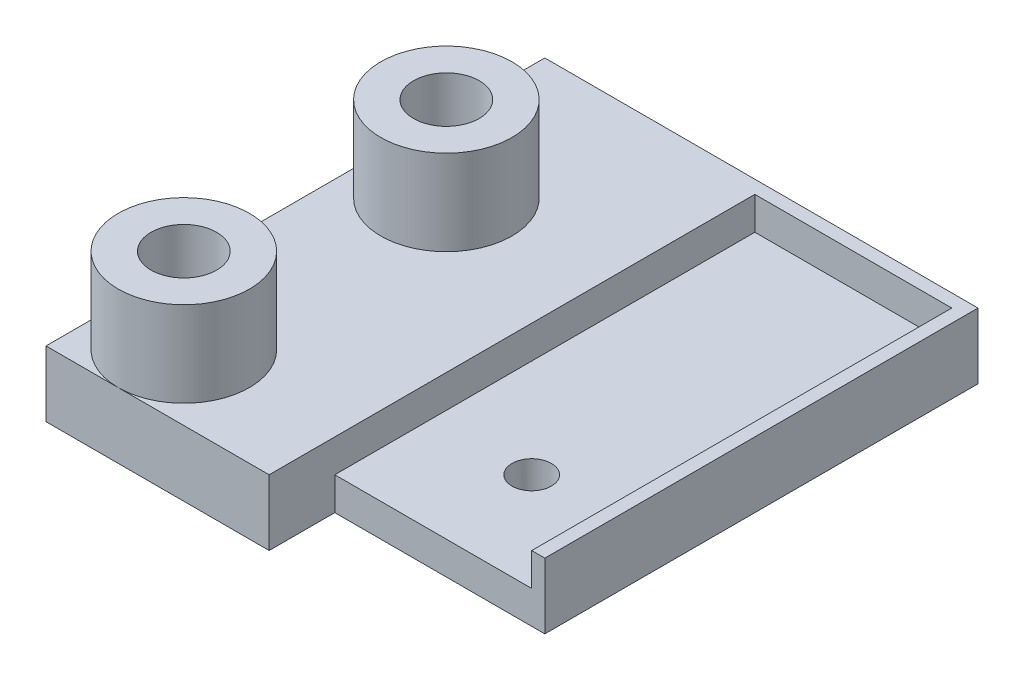
ISO-10303-21;
HEADER;
FILE_DESCRIPTION(('STEP AP214'),'2;1');
FILE_NAME('part.step','',(''),(''),'','','');
FILE_SCHEMA(('AUTOMOTIVE_DESIGN { 1 0 10303 214 1 1 1 1 }'));
ENDSEC;
DATA;
#1=APPLICATION_CONTEXT('core data for automotive mechanical design processes');
#2=APPLICATION_PROTOCOL_DEFINITION('international standard','automotive_design',2000,#1);
#3=PRODUCT_CONTEXT('',#1,'mechanical');
#4=PRODUCT('Part','Part','',(#3));
#5=PRODUCT_RELATED_PRODUCT_CATEGORY('part','',(#4));
#6=PRODUCT_DEFINITION_FORMATION('','',#4);
#7=PRODUCT_DEFINITION_CONTEXT('part definition',#1,'design');
#8=PRODUCT_DEFINITION('design','',#6,#7);
#9=PRODUCT_DEFINITION_SHAPE('','',#8);
#10=(LENGTH_UNIT() NAMED_UNIT(*) SI_UNIT(.MILLI.,.METRE.));
#11=(NAMED_UNIT(*) PLANE_ANGLE_UNIT() SI_UNIT($,.RADIAN.));
#12=(NAMED_UNIT(*) SI_UNIT($,.STERADIAN.) SOLID_ANGLE_UNIT());
#13=UNCERTAINTY_MEASURE_WITH_UNIT(LENGTH_MEASURE(1.E-05),#10,'distance_accuracy_value','');
#14=(GEOMETRIC_REPRESENTATION_CONTEXT(3) GLOBAL_UNCERTAINTY_ASSIGNED_CONTEXT((#13)) GLOBAL_UNIT_ASSIGNED_CONTEXT((#10,
#11,#12)) REPRESENTATION_CONTEXT('',''));
#15=CARTESIAN_POINT('',(0.,0.,0.));
#16=DIRECTION('',(0.,0.,1.));
#17=DIRECTION('',(1.,0.,0.));
#18=AXIS2_PLACEMENT_3D('',#15,#16,#17);
#19=CARTESIAN_POINT('',(0.,5.,0.));
#20=DIRECTION('',(0.,0.,-1.));
#21=DIRECTION('',(-1.,0.,0.));
#22=AXIS2_PLACEMENT_3D('',#19,#20,#21);
#23=PLANE('',#22);
#24=DIRECTION('',(0.,1.,0.));
#25=VECTOR('',#24,1.);
#26=CARTESIAN_POINT('',(-16.,-17.7200451466694,0.));
#27=LINE('',#26,#25);
#28=CARTESIAN_POINT('',(-16.,0.,0.));
#29=VERTEX_POINT('',#28);
#30=CARTESIAN_POINT('',(-16.,2.5,0.));
#31=VERTEX_POINT('',#30);
#32=EDGE_CURVE('E65',#29,#31,#27,.T.);
#33=ORIENTED_EDGE('',*,*,#32,.F.);
#34=DIRECTION('',(1.,0.,0.));
#35=VECTOR('',#34,1.);
#36=CARTESIAN_POINT('',(0.,0.,0.));
#37=LINE('',#36,#35);
#38=CARTESIAN_POINT('',(0.,0.,0.));
#39=VERTEX_POINT('',#38);
#40=EDGE_CURVE('E200',#29,#39,#37,.T.);
#41=ORIENTED_EDGE('',*,*,#40,.T.);
#42=DIRECTION('',(0.,-1.,0.));
#43=VECTOR('',#42,1.);
#44=CARTESIAN_POINT('',(0.,5.,0.));
#45=LINE('',#44,#43);
#46=CARTESIAN_POINT('',(0.,5.,0.));
#47=VERTEX_POINT('',#46);
#48=EDGE_CURVE('E205',#47,#39,#45,.T.);
#49=ORIENTED_EDGE('',*,*,#48,.F.);
#50=DIRECTION('',(1.,0.,0.));
#51=VECTOR('',#50,1.);
#52=CARTESIAN_POINT('',(0.,5.,0.));
#53=LINE('',#52,#51);
#54=CARTESIAN_POINT('',(-0.999999999999996,5.,0.));
#55=VERTEX_POINT('',#54);
#56=EDGE_CURVE('E130',#55,#47,#53,.T.);
#57=ORIENTED_EDGE('',*,*,#56,.F.);
#58=DIRECTION('',(0.,1.,0.));
#59=VECTOR('',#58,1.);
#60=CARTESIAN_POINT('',(-0.999999999999996,2.5,0.));
#61=LINE('',#60,#59);
#62=CARTESIAN_POINT('',(-0.999999999999996,2.5,0.));
#63=VERTEX_POINT('',#62);
#64=EDGE_CURVE('E187',#63,#55,#61,.T.);
#65=ORIENTED_EDGE('',*,*,#64,.F.);
#66=DIRECTION('',(1.,0.,0.));
#67=VECTOR('',#66,1.);
#68=CARTESIAN_POINT('',(-0.999999999999996,2.5,0.));
#69=LINE('',#68,#67);
#70=EDGE_CURVE('E172',#31,#63,#69,.T.);
#71=ORIENTED_EDGE('',*,*,#70,.F.);
#72=EDGE_LOOP('',(#33,#41,#49,#57,#65,#71));
#73=FACE_BOUND('',#72,.T.);
#74=ADVANCED_FACE('F43',(#73),#23,.F.);
#75=CARTESIAN_POINT('',(0.,5.,0.));
#76=DIRECTION('',(-1.,0.,0.));
#77=DIRECTION('',(0.,0.,1.));
#78=AXIS2_PLACEMENT_3D('',#75,#76,#77);
#79=PLANE('',#78);
#80=DIRECTION('',(0.,0.,-1.));
#81=VECTOR('',#80,1.);
#82=CARTESIAN_POINT('',(0.,0.,0.));
#83=LINE('',#82,#81);
#84=CARTESIAN_POINT('',(0.,0.,-33.));
#85=VERTEX_POINT('',#84);
#86=EDGE_CURVE('E190',#39,#85,#83,.T.);
#87=ORIENTED_EDGE('',*,*,#86,.T.);
#88=DIRECTION('',(0.,-1.,0.));
#89=VECTOR('',#88,1.);
#90=CARTESIAN_POINT('',(0.,5.,-33.));
#91=LINE('',#90,#89);
#92=CARTESIAN_POINT('',(0.,5.,-33.));
#93=VERTEX_POINT('',#92);
#94=EDGE_CURVE('E11',#93,#85,#91,.T.);
#95=ORIENTED_EDGE('',*,*,#94,.F.);
#96=DIRECTION('',(0.,0.,-1.));
#97=VECTOR('',#96,1.);
#98=CARTESIAN_POINT('',(0.,5.,0.));
#99=LINE('',#98,#97);
#100=EDGE_CURVE('E197',#47,#93,#99,.T.);
#101=ORIENTED_EDGE('',*,*,#100,.F.);
#102=ORIENTED_EDGE('',*,*,#48,.T.);
#103=EDGE_LOOP('',(#87,#95,#101,#102));
#104=FACE_BOUND('',#103,.T.);
#105=ADVANCED_FACE('F45',(#104),#79,.F.);
#106=CARTESIAN_POINT('',(0.,5.,-33.));
#107=DIRECTION('',(0.,0.,1.));
#108=DIRECTION('',(1.,0.,0.));
#109=AXIS2_PLACEMENT_3D('',#106,#107,#108);
#110=PLANE('',#109);
#111=DIRECTION('',(-1.,0.,0.));
#112=VECTOR('',#111,1.);
#113=CARTESIAN_POINT('',(0.,0.,-33.));
#114=LINE('',#113,#112);
#115=CARTESIAN_POINT('',(-33.,0.,-33.));
#116=VERTEX_POINT('',#115);
#117=EDGE_CURVE('E209',#85,#116,#114,.T.);
#118=ORIENTED_EDGE('',*,*,#117,.T.);
#119=DIRECTION('',(0.,-1.,0.));
#120=VECTOR('',#119,1.);
#121=CARTESIAN_POINT('',(-33.,5.,-33.));
#122=LINE('',#121,#120);
#123=CARTESIAN_POINT('',(-33.,5.,-33.));
#124=VERTEX_POINT('',#123);
#125=EDGE_CURVE('E53',#124,#116,#122,.T.);
#126=ORIENTED_EDGE('',*,*,#125,.F.);
#127=DIRECTION('',(-1.,0.,0.));
#128=VECTOR('',#127,1.);
#129=CARTESIAN_POINT('',(0.,5.,-33.));
#130=LINE('',#129,#128);
#131=EDGE_CURVE('E125',#93,#124,#130,.T.);
#132=ORIENTED_EDGE('',*,*,#131,.F.);
#133=ORIENTED_EDGE('',*,*,#94,.T.);
#134=EDGE_LOOP('',(#118,#126,#132,#133));
#135=FACE_BOUND('',#134,.T.);
#136=ADVANCED_FACE('F287',(#135),#110,.F.);
#137=CARTESIAN_POINT('',(-33.,5.,0.));
#138=DIRECTION('',(1.,0.,0.));
#139=DIRECTION('',(0.,0.,-1.));
#140=AXIS2_PLACEMENT_3D('',#137,#138,#139);
#141=PLANE('',#140);
#142=DIRECTION('',(0.,0.,1.));
#143=VECTOR('',#142,1.);
#144=CARTESIAN_POINT('',(-33.,0.,0.));
#145=LINE('',#144,#143);
#146=CARTESIAN_POINT('',(-33.,0.,5.));
#147=VERTEX_POINT('',#146);
#148=EDGE_CURVE('E136',#116,#147,#145,.T.);
#149=ORIENTED_EDGE('',*,*,#148,.T.);
#150=DIRECTION('',(0.,1.,0.));
#151=VECTOR('',#150,1.);
#152=CARTESIAN_POINT('',(-33.,-17.7200451466694,5.));
#153=LINE('',#152,#151);
#154=CARTESIAN_POINT('',(-33.,5.,5.));
#155=VERTEX_POINT('',#154);
#156=EDGE_CURVE('E133',#147,#155,#153,.T.);
#157=ORIENTED_EDGE('',*,*,#156,.T.);
#158=DIRECTION('',(0.,0.,1.));
#159=VECTOR('',#158,1.);
#160=CARTESIAN_POINT('',(-33.,5.,0.));
#161=LINE('',#160,#159);
#162=EDGE_CURVE('E119',#124,#155,#161,.T.);
#163=ORIENTED_EDGE('',*,*,#162,.F.);
#164=ORIENTED_EDGE('',*,*,#125,.T.);
#165=EDGE_LOOP('',(#149,#157,#163,#164));
#166=FACE_BOUND('',#165,.T.);
#167=ADVANCED_FACE('F134',(#166),#141,.F.);
#168=CARTESIAN_POINT('',(0.,5.,0.));
#169=DIRECTION('',(0.,1.,0.));
#170=DIRECTION('',(0.,0.,1.));
#171=AXIS2_PLACEMENT_3D('',#168,#169,#170);
#172=PLANE('',#171);
#173=CARTESIAN_POINT('',(-27.5,5.,-20.));
#174=DIRECTION('',(0.,1.,0.));
#175=DIRECTION('',(0.,0.,1.));
#176=AXIS2_PLACEMENT_3D('',#173,#174,#175);
#177=CIRCLE('',#176,5.);
#178=CARTESIAN_POINT('',(-27.5,5.,-25.));
#179=VERTEX_POINT('',#178);
#180=EDGE_CURVE('E229',#179,#179,#177,.T.);
#181=ORIENTED_EDGE('',*,*,#180,.F.);
#182=EDGE_LOOP('',(#181));
#183=FACE_BOUND('',#182,.T.);
#184=DIRECTION('',(1.,0.,0.));
#185=VECTOR('',#184,1.);
#186=CARTESIAN_POINT('',(-16.,5.,5.));
#187=LINE('',#186,#185);
#188=CARTESIAN_POINT('',(-27.5,5.,5.));
#189=VERTEX_POINT('',#188);
#190=EDGE_CURVE('E123',#155,#189,#187,.T.);
#191=ORIENTED_EDGE('',*,*,#190,.T.);
#192=CARTESIAN_POINT('',(-27.5,5.,0.));
#193=DIRECTION('',(0.,1.,0.));
#194=DIRECTION('',(0.,0.,1.));
#195=AXIS2_PLACEMENT_3D('',#192,#193,#194);
#196=CIRCLE('',#195,5.);
#197=EDGE_CURVE('E58',#189,#189,#196,.T.);
#198=ORIENTED_EDGE('',*,*,#197,.F.);
#199=CARTESIAN_POINT('',(-16.,5.,5.));
#200=VERTEX_POINT('',#199);
#201=EDGE_CURVE('E146',#189,#200,#187,.T.);
#202=ORIENTED_EDGE('',*,*,#201,.T.);
#203=DIRECTION('',(0.,0.,1.));
#204=VECTOR('',#203,1.);
#205=CARTESIAN_POINT('',(-16.,5.,-32.));
#206=LINE('',#205,#204);
#207=CARTESIAN_POINT('',(-16.,5.,-32.));
#208=VERTEX_POINT('',#207);
#209=EDGE_CURVE('E165',#208,#200,#206,.T.);
#210=ORIENTED_EDGE('',*,*,#209,.F.);
#211=DIRECTION('',(-1.,0.,0.));
#212=VECTOR('',#211,1.);
#213=CARTESIAN_POINT('',(-1.,5.,-32.));
#214=LINE('',#213,#212);
#215=CARTESIAN_POINT('',(-1.,5.,-32.));
#216=VERTEX_POINT('',#215);
#217=EDGE_CURVE('E180',#216,#208,#214,.T.);
#218=ORIENTED_EDGE('',*,*,#217,.F.);
#219=DIRECTION('',(0.,0.,-1.));
#220=VECTOR('',#219,1.);
#221=CARTESIAN_POINT('',(-1.,5.,-32.));
#222=LINE('',#221,#220);
#223=EDGE_CURVE('E177',#55,#216,#222,.T.);
#224=ORIENTED_EDGE('',*,*,#223,.F.);
#225=ORIENTED_EDGE('',*,*,#56,.T.);
#226=ORIENTED_EDGE('',*,*,#100,.T.);
#227=ORIENTED_EDGE('',*,*,#131,.T.);
#228=ORIENTED_EDGE('',*,*,#162,.T.);
#229=EDGE_LOOP('',(#191,#198,#202,#210,#218,#224,#225,#226,#227,#228));
#230=FACE_BOUND('',#229,.T.);
#231=ADVANCED_FACE('F121',(#183,#230),#172,.T.);
#232=CARTESIAN_POINT('',(0.,0.,0.));
#233=DIRECTION('',(0.,1.,0.));
#234=DIRECTION('',(0.,0.,1.));
#235=AXIS2_PLACEMENT_3D('',#232,#233,#234);
#236=PLANE('',#235);
#237=CARTESIAN_POINT('',(-27.5,0.,-20.));
#238=DIRECTION('',(0.,1.,0.));
#239=DIRECTION('',(0.,0.,1.));
#240=AXIS2_PLACEMENT_3D('',#237,#238,#239);
#241=CIRCLE('',#240,2.5);
#242=CARTESIAN_POINT('',(-27.5,0.,-22.5));
#243=VERTEX_POINT('',#242);
#244=EDGE_CURVE('E258',#243,#243,#241,.T.);
#245=ORIENTED_EDGE('',*,*,#244,.T.);
#246=EDGE_LOOP('',(#245));
#247=FACE_BOUND('',#246,.T.);
#248=CARTESIAN_POINT('',(-27.5,0.,0.));
#249=DIRECTION('',(0.,1.,0.));
#250=DIRECTION('',(0.,0.,1.));
#251=AXIS2_PLACEMENT_3D('',#248,#249,#250);
#252=CIRCLE('',#251,2.5);
#253=CARTESIAN_POINT('',(-27.5,0.,-2.5));
#254=VERTEX_POINT('',#253);
#255=EDGE_CURVE('E254',#254,#254,#252,.T.);
#256=ORIENTED_EDGE('',*,*,#255,.T.);
#257=EDGE_LOOP('',(#256));
#258=FACE_BOUND('',#257,.T.);
#259=CARTESIAN_POINT('',(-8.5,0.,-7.50000000000001));
#260=DIRECTION('',(0.,1.,0.));
#261=DIRECTION('',(0.,0.,1.));
#262=AXIS2_PLACEMENT_3D('',#259,#260,#261);
#263=CIRCLE('',#262,1.5);
#264=CARTESIAN_POINT('',(-8.5,0.,-6.00000000000001));
#265=VERTEX_POINT('',#264);
#266=EDGE_CURVE('E250',#265,#265,#263,.T.);
#267=ORIENTED_EDGE('',*,*,#266,.T.);
#268=EDGE_LOOP('',(#267));
#269=FACE_BOUND('',#268,.T.);
#270=ORIENTED_EDGE('',*,*,#86,.F.);
#271=ORIENTED_EDGE('',*,*,#40,.F.);
#272=DIRECTION('',(0.,0.,1.));
#273=VECTOR('',#272,1.);
#274=CARTESIAN_POINT('',(-16.,0.,0.));
#275=LINE('',#274,#273);
#276=CARTESIAN_POINT('',(-16.,0.,5.));
#277=VERTEX_POINT('',#276);
#278=EDGE_CURVE('E155',#29,#277,#275,.T.);
#279=ORIENTED_EDGE('',*,*,#278,.T.);
#280=DIRECTION('',(-1.,0.,0.));
#281=VECTOR('',#280,1.);
#282=CARTESIAN_POINT('',(-16.,0.,5.));
#283=LINE('',#282,#281);
#284=EDGE_CURVE('E158',#277,#147,#283,.T.);
#285=ORIENTED_EDGE('',*,*,#284,.T.);
#286=ORIENTED_EDGE('',*,*,#148,.F.);
#287=ORIENTED_EDGE('',*,*,#117,.F.);
#288=EDGE_LOOP('',(#270,#271,#279,#285,#286,#287));
#289=FACE_BOUND('',#288,.T.);
#290=ADVANCED_FACE('F223',(#247,#258,#269,#289),#236,.F.);
#291=CARTESIAN_POINT('',(-1.,2.5,-32.));
#292=DIRECTION('',(1.,0.,0.));
#293=DIRECTION('',(0.,0.,-1.));
#294=AXIS2_PLACEMENT_3D('',#291,#292,#293);
#295=PLANE('',#294);
#296=ORIENTED_EDGE('',*,*,#223,.T.);
#297=DIRECTION('',(0.,1.,0.));
#298=VECTOR('',#297,1.);
#299=CARTESIAN_POINT('',(-1.,2.5,-32.));
#300=LINE('',#299,#298);
#301=CARTESIAN_POINT('',(-1.,2.5,-32.));
#302=VERTEX_POINT('',#301);
#303=EDGE_CURVE('E176',#302,#216,#300,.T.);
#304=ORIENTED_EDGE('',*,*,#303,.F.);
#305=DIRECTION('',(0.,0.,-1.));
#306=VECTOR('',#305,1.);
#307=CARTESIAN_POINT('',(-1.,2.5,-32.));
#308=LINE('',#307,#306);
#309=EDGE_CURVE('E160',#63,#302,#308,.T.);
#310=ORIENTED_EDGE('',*,*,#309,.F.);
#311=ORIENTED_EDGE('',*,*,#64,.T.);
#312=EDGE_LOOP('',(#296,#304,#310,#311));
#313=FACE_BOUND('',#312,.T.);
#314=ADVANCED_FACE('F310',(#313),#295,.F.);
#315=CARTESIAN_POINT('',(-16.,2.5,-32.));
#316=DIRECTION('',(-1.,0.,0.));
#317=DIRECTION('',(0.,0.,1.));
#318=AXIS2_PLACEMENT_3D('',#315,#316,#317);
#319=PLANE('',#318);
#320=ORIENTED_EDGE('',*,*,#209,.T.);
#321=DIRECTION('',(0.,1.,0.));
#322=VECTOR('',#321,1.);
#323=CARTESIAN_POINT('',(-16.,-17.7200451466694,5.));
#324=LINE('',#323,#322);
#325=EDGE_CURVE('E141',#277,#200,#324,.T.);
#326=ORIENTED_EDGE('',*,*,#325,.F.);
#327=ORIENTED_EDGE('',*,*,#278,.F.);
#328=ORIENTED_EDGE('',*,*,#32,.T.);
#329=DIRECTION('',(0.,0.,1.));
#330=VECTOR('',#329,1.);
#331=CARTESIAN_POINT('',(-16.,2.5,-32.));
#332=LINE('',#331,#330);
#333=CARTESIAN_POINT('',(-16.,2.5,-32.));
#334=VERTEX_POINT('',#333);
#335=EDGE_CURVE('E169',#334,#31,#332,.T.);
#336=ORIENTED_EDGE('',*,*,#335,.F.);
#337=DIRECTION('',(0.,1.,0.));
#338=VECTOR('',#337,1.);
#339=CARTESIAN_POINT('',(-16.,2.5,-32.));
#340=LINE('',#339,#338);
#341=EDGE_CURVE('E191',#334,#208,#340,.T.);
#342=ORIENTED_EDGE('',*,*,#341,.T.);
#343=EDGE_LOOP('',(#320,#326,#327,#328,#336,#342));
#344=FACE_BOUND('',#343,.T.);
#345=ADVANCED_FACE('F300',(#344),#319,.F.);
#346=CARTESIAN_POINT('',(-1.,2.5,-32.));
#347=DIRECTION('',(0.,0.,-1.));
#348=DIRECTION('',(-1.,0.,0.));
#349=AXIS2_PLACEMENT_3D('',#346,#347,#348);
#350=PLANE('',#349);
#351=ORIENTED_EDGE('',*,*,#217,.T.);
#352=ORIENTED_EDGE('',*,*,#341,.F.);
#353=DIRECTION('',(-1.,0.,0.));
#354=VECTOR('',#353,1.);
#355=CARTESIAN_POINT('',(-1.,2.5,-32.));
#356=LINE('',#355,#354);
#357=EDGE_CURVE('E164',#302,#334,#356,.T.);
#358=ORIENTED_EDGE('',*,*,#357,.F.);
#359=ORIENTED_EDGE('',*,*,#303,.T.);
#360=EDGE_LOOP('',(#351,#352,#358,#359));
#361=FACE_BOUND('',#360,.T.);
#362=ADVANCED_FACE('F307',(#361),#350,.F.);
#363=CARTESIAN_POINT('',(0.,2.5,0.));
#364=DIRECTION('',(0.,-1.,0.));
#365=DIRECTION('',(0.,0.,-1.));
#366=AXIS2_PLACEMENT_3D('',#363,#364,#365);
#367=PLANE('',#366);
#368=CARTESIAN_POINT('',(-8.5,2.5,-7.50000000000001));
#369=DIRECTION('',(0.,-1.,0.));
#370=DIRECTION('',(0.,0.,-1.));
#371=AXIS2_PLACEMENT_3D('',#368,#369,#370);
#372=CIRCLE('',#371,1.5);
#373=CARTESIAN_POINT('',(-8.5,2.5,-9.00000000000001));
#374=VERTEX_POINT('',#373);
#375=EDGE_CURVE('E47',#374,#374,#372,.T.);
#376=ORIENTED_EDGE('',*,*,#375,.T.);
#377=EDGE_LOOP('',(#376));
#378=FACE_BOUND('',#377,.T.);
#379=ORIENTED_EDGE('',*,*,#309,.T.);
#380=ORIENTED_EDGE('',*,*,#357,.T.);
#381=ORIENTED_EDGE('',*,*,#335,.T.);
#382=ORIENTED_EDGE('',*,*,#70,.T.);
#383=EDGE_LOOP('',(#379,#380,#381,#382));
#384=FACE_BOUND('',#383,.T.);
#385=ADVANCED_FACE('F267',(#378,#384),#367,.F.);
#386=CARTESIAN_POINT('',(-16.,-17.7200451466694,5.));
#387=DIRECTION('',(0.,0.,1.));
#388=DIRECTION('',(1.,0.,0.));
#389=AXIS2_PLACEMENT_3D('',#386,#387,#388);
#390=PLANE('',#389);
#391=ORIENTED_EDGE('',*,*,#284,.F.);
#392=ORIENTED_EDGE('',*,*,#325,.T.);
#393=ORIENTED_EDGE('',*,*,#201,.F.);
#394=ORIENTED_EDGE('',*,*,#190,.F.);
#395=ORIENTED_EDGE('',*,*,#156,.F.);
#396=EDGE_LOOP('',(#391,#392,#393,#394,#395));
#397=FACE_BOUND('',#396,.T.);
#398=ADVANCED_FACE('F144',(#397),#390,.T.);
#399=CARTESIAN_POINT('',(-27.5,11.5,-20.));
#400=DIRECTION('',(0.,-1.,0.));
#401=DIRECTION('',(0.,0.,-1.));
#402=AXIS2_PLACEMENT_3D('',#399,#400,#401);
#403=CYLINDRICAL_SURFACE('',#402,2.5);
#404=CARTESIAN_POINT('',(-27.5,11.5,-20.));
#405=DIRECTION('',(0.,1.,0.));
#406=DIRECTION('',(0.,0.,1.));
#407=AXIS2_PLACEMENT_3D('',#404,#405,#406);
#408=CIRCLE('',#407,2.5);
#409=CARTESIAN_POINT('',(-27.5,11.5,-22.5));
#410=VERTEX_POINT('',#409);
#411=EDGE_CURVE('E233',#410,#410,#408,.T.);
#412=CARTESIAN_POINT('',(-27.5,11.5,-22.5));
#413=CARTESIAN_POINT('',(-27.5,11.3802083333333,-22.5));
#414=CARTESIAN_POINT('',(-27.5,11.2604166666667,-22.5));
#415=CARTESIAN_POINT('',(-27.5,11.0208333333333,-22.5));
#416=CARTESIAN_POINT('',(-27.5,10.9010416666667,-22.5));
#417=CARTESIAN_POINT('',(-27.5,10.6614583333333,-22.5));
#418=CARTESIAN_POINT('',(-27.5,10.5416666666667,-22.5));
#419=CARTESIAN_POINT('',(-27.5,10.3020833333333,-22.5));
#420=CARTESIAN_POINT('',(-27.5,10.1822916666667,-22.5));
#421=CARTESIAN_POINT('',(-27.5,9.94270833333333,-22.5));
#422=CARTESIAN_POINT('',(-27.5,9.82291666666667,-22.5));
#423=CARTESIAN_POINT('',(-27.5,9.58333333333333,-22.5));
#424=CARTESIAN_POINT('',(-27.5,9.46354166666667,-22.5));
#425=CARTESIAN_POINT('',(-27.5,9.22395833333333,-22.5));
#426=CARTESIAN_POINT('',(-27.5,9.10416666666667,-22.5));
#427=CARTESIAN_POINT('',(-27.5,8.86458333333333,-22.5));
#428=CARTESIAN_POINT('',(-27.5,8.74479166666667,-22.5));
#429=CARTESIAN_POINT('',(-27.5,8.50520833333333,-22.5));
#430=CARTESIAN_POINT('',(-27.5,8.38541666666667,-22.5));
#431=CARTESIAN_POINT('',(-27.5,8.14583333333333,-22.5));
#432=CARTESIAN_POINT('',(-27.5,8.02604166666667,-22.5));
#433=CARTESIAN_POINT('',(-27.5,7.78645833333333,-22.5));
#434=CARTESIAN_POINT('',(-27.5,7.66666666666667,-22.5));
#435=CARTESIAN_POINT('',(-27.5,7.42708333333333,-22.5));
#436=CARTESIAN_POINT('',(-27.5,7.30729166666667,-22.5));
#437=CARTESIAN_POINT('',(-27.5,7.06770833333333,-22.5));
#438=CARTESIAN_POINT('',(-27.5,6.94791666666667,-22.5));
#439=CARTESIAN_POINT('',(-27.5,6.70833333333333,-22.5));
#440=CARTESIAN_POINT('',(-27.5,6.58854166666667,-22.5));
#441=CARTESIAN_POINT('',(-27.5,6.34895833333333,-22.5));
#442=CARTESIAN_POINT('',(-27.5,6.22916666666667,-22.5));
#443=CARTESIAN_POINT('',(-27.5,5.98958333333333,-22.5));
#444=CARTESIAN_POINT('',(-27.5,5.86979166666667,-22.5));
#445=CARTESIAN_POINT('',(-27.5,5.63020833333333,-22.5));
#446=CARTESIAN_POINT('',(-27.5,5.51041666666667,-22.5));
#447=CARTESIAN_POINT('',(-27.5,5.27083333333333,-22.5));
#448=CARTESIAN_POINT('',(-27.5,5.15104166666667,-22.5));
#449=CARTESIAN_POINT('',(-27.5,4.91145833333333,-22.5));
#450=CARTESIAN_POINT('',(-27.5,4.79166666666667,-22.5));
#451=CARTESIAN_POINT('',(-27.5,4.55208333333333,-22.5));
#452=CARTESIAN_POINT('',(-27.5,4.43229166666667,-22.5));
#453=CARTESIAN_POINT('',(-27.5,4.19270833333333,-22.5));
#454=CARTESIAN_POINT('',(-27.5,4.07291666666667,-22.5));
#455=CARTESIAN_POINT('',(-27.5,3.83333333333333,-22.5));
#456=CARTESIAN_POINT('',(-27.5,3.71354166666666,-22.5));
#457=CARTESIAN_POINT('',(-27.5,3.47395833333333,-22.5));
#458=CARTESIAN_POINT('',(-27.5,3.35416666666667,-22.5));
#459=CARTESIAN_POINT('',(-27.5,3.11458333333333,-22.5));
#460=CARTESIAN_POINT('',(-27.5,2.99479166666667,-22.5));
#461=CARTESIAN_POINT('',(-27.5,2.75520833333333,-22.5));
#462=CARTESIAN_POINT('',(-27.5,2.63541666666667,-22.5));
#463=CARTESIAN_POINT('',(-27.5,2.39583333333333,-22.5));
#464=CARTESIAN_POINT('',(-27.5,2.27604166666667,-22.5));
#465=CARTESIAN_POINT('',(-27.5,2.03645833333333,-22.5));
#466=CARTESIAN_POINT('',(-27.5,1.91666666666666,-22.5));
#467=CARTESIAN_POINT('',(-27.5,1.67708333333333,-22.5));
#468=CARTESIAN_POINT('',(-27.5,1.55729166666666,-22.5));
#469=CARTESIAN_POINT('',(-27.5,1.31770833333333,-22.5));
#470=CARTESIAN_POINT('',(-27.5,1.19791666666667,-22.5));
#471=CARTESIAN_POINT('',(-27.5,0.958333333333332,-22.5));
#472=CARTESIAN_POINT('',(-27.5,0.838541666666666,-22.5));
#473=CARTESIAN_POINT('',(-27.5,0.598958333333332,-22.5));
#474=CARTESIAN_POINT('',(-27.5,0.479166666666665,-22.5));
#475=CARTESIAN_POINT('',(-27.5,0.239583333333332,-22.5));
#476=CARTESIAN_POINT('',(-27.5,0.119791666666665,-22.5));
#477=CARTESIAN_POINT('',(-27.5,0.,-22.5));
#478=B_SPLINE_CURVE_WITH_KNOTS('',3,(#412,#413,#414,#415,#416,#417,#418,#419,#420,#421,#422,
#423,#424,#425,#426,#427,#428,#429,#430,#431,#432,#433,#434,#435,#436,#437,#438,#439,#440,#441,
#442,#443,#444,#445,#446,#447,#448,#449,#450,#451,#452,#453,#454,#455,#456,#457,#458,#459,#460,
#461,#462,#463,#464,#465,#466,#467,#468,#469,#470,#471,#472,#473,#474,#475,#476,#477),
.UNSPECIFIED.,.F.,.F.,(4,2,2,2,2,2,2,2,2,2,2,2,2,2,2,2,2,2,2,2,2,2,2,2,2,2,2,2,2,2,2,2,4),(0.,
0.359374999999999,0.718749999999999,1.078125,1.4375,1.796875,2.15625,2.515625,2.875,3.234375,
3.59375,3.953125,4.3125,4.671875,5.03125,5.390625,5.75,6.109375,6.46875,6.828125,7.1875,
7.546875,7.90625,8.265625,8.625,8.984375,9.34375,9.703125,10.0625,10.421875,10.78125,11.140625,
11.5),.UNSPECIFIED.);
#479=EDGE_CURVE('BSEAM318',#410,#243,#478,.T.);
#480=ORIENTED_EDGE('',*,*,#411,.T.);
#481=ORIENTED_EDGE('',*,*,#244,.F.);
#482=ORIENTED_EDGE('',*,*,#479,.T.);
#483=ORIENTED_EDGE('',*,*,#479,.F.);
#484=EDGE_LOOP('',(#480,#482,#481,#483));
#485=FACE_BOUND('',#484,.T.);
#486=ADVANCED_FACE('F318',(#485),#403,.F.);
#487=CARTESIAN_POINT('',(-27.5,11.5,-20.));
#488=DIRECTION('',(0.,-1.,0.));
#489=DIRECTION('',(0.,0.,-1.));
#490=AXIS2_PLACEMENT_3D('',#487,#488,#489);
#491=CYLINDRICAL_SURFACE('',#490,5.);
#492=CARTESIAN_POINT('',(-27.5,11.5,-20.));
#493=DIRECTION('',(0.,1.,0.));
#494=DIRECTION('',(0.,0.,1.));
#495=AXIS2_PLACEMENT_3D('',#492,#493,#494);
#496=CIRCLE('',#495,5.);
#497=CARTESIAN_POINT('',(-27.5,11.5,-25.));
#498=VERTEX_POINT('',#497);
#499=EDGE_CURVE('E152',#498,#498,#496,.T.);
#500=CARTESIAN_POINT('',(-27.5,11.5,-25.));
#501=CARTESIAN_POINT('',(-27.5,11.4322916666667,-25.));
#502=CARTESIAN_POINT('',(-27.5,11.3645833333333,-25.));
#503=CARTESIAN_POINT('',(-27.5,11.2291666666667,-25.));
#504=CARTESIAN_POINT('',(-27.5,11.1614583333333,-25.));
#505=CARTESIAN_POINT('',(-27.5,11.0260416666667,-25.));
#506=CARTESIAN_POINT('',(-27.5,10.9583333333333,-25.));
#507=CARTESIAN_POINT('',(-27.5,10.8229166666667,-25.));
#508=CARTESIAN_POINT('',(-27.5,10.7552083333333,-25.));
#509=CARTESIAN_POINT('',(-27.5,10.6197916666667,-25.));
#510=CARTESIAN_POINT('',(-27.5,10.5520833333333,-25.));
#511=CARTESIAN_POINT('',(-27.5,10.4166666666667,-25.));
#512=CARTESIAN_POINT('',(-27.5,10.3489583333333,-25.));
#513=CARTESIAN_POINT('',(-27.5,10.2135416666667,-25.));
#514=CARTESIAN_POINT('',(-27.5,10.1458333333333,-25.));
#515=CARTESIAN_POINT('',(-27.5,10.0104166666667,-25.));
#516=CARTESIAN_POINT('',(-27.5,9.94270833333333,-25.));
#517=CARTESIAN_POINT('',(-27.5,9.80729166666667,-25.));
#518=CARTESIAN_POINT('',(-27.5,9.73958333333333,-25.));
#519=CARTESIAN_POINT('',(-27.5,9.60416666666667,-25.));
#520=CARTESIAN_POINT('',(-27.5,9.53645833333333,-25.));
#521=CARTESIAN_POINT('',(-27.5,9.40104166666667,-25.));
#522=CARTESIAN_POINT('',(-27.5,9.33333333333333,-25.));
#523=CARTESIAN_POINT('',(-27.5,9.19791666666667,-25.));
#524=CARTESIAN_POINT('',(-27.5,9.13020833333333,-25.));
#525=CARTESIAN_POINT('',(-27.5,8.99479166666667,-25.));
#526=CARTESIAN_POINT('',(-27.5,8.92708333333333,-25.));
#527=CARTESIAN_POINT('',(-27.5,8.79166666666667,-25.));
#528=CARTESIAN_POINT('',(-27.5,8.72395833333333,-25.));
#529=CARTESIAN_POINT('',(-27.5,8.58854166666667,-25.));
#530=CARTESIAN_POINT('',(-27.5,8.52083333333333,-25.));
#531=CARTESIAN_POINT('',(-27.5,8.38541666666667,-25.));
#532=CARTESIAN_POINT('',(-27.5,8.31770833333333,-25.));
#533=CARTESIAN_POINT('',(-27.5,8.18229166666667,-25.));
#534=CARTESIAN_POINT('',(-27.5,8.11458333333333,-25.));
#535=CARTESIAN_POINT('',(-27.5,7.97916666666667,-25.));
#536=CARTESIAN_POINT('',(-27.5,7.91145833333333,-25.));
#537=CARTESIAN_POINT('',(-27.5,7.77604166666667,-25.));
#538=CARTESIAN_POINT('',(-27.5,7.70833333333333,-25.));
#539=CARTESIAN_POINT('',(-27.5,7.57291666666667,-25.));
#540=CARTESIAN_POINT('',(-27.5,7.50520833333333,-25.));
#541=CARTESIAN_POINT('',(-27.5,7.36979166666667,-25.));
#542=CARTESIAN_POINT('',(-27.5,7.30208333333333,-25.));
#543=CARTESIAN_POINT('',(-27.5,7.16666666666667,-25.));
#544=CARTESIAN_POINT('',(-27.5,7.09895833333333,-25.));
#545=CARTESIAN_POINT('',(-27.5,6.96354166666667,-25.));
#546=CARTESIAN_POINT('',(-27.5,6.89583333333333,-25.));
#547=CARTESIAN_POINT('',(-27.5,6.76041666666667,-25.));
#548=CARTESIAN_POINT('',(-27.5,6.69270833333333,-25.));
#549=CARTESIAN_POINT('',(-27.5,6.55729166666667,-25.));
#550=CARTESIAN_POINT('',(-27.5,6.48958333333333,-25.));
#551=CARTESIAN_POINT('',(-27.5,6.35416666666667,-25.));
#552=CARTESIAN_POINT('',(-27.5,6.28645833333333,-25.));
#553=CARTESIAN_POINT('',(-27.5,6.15104166666667,-25.));
#554=CARTESIAN_POINT('',(-27.5,6.08333333333333,-25.));
#555=CARTESIAN_POINT('',(-27.5,5.94791666666667,-25.));
#556=CARTESIAN_POINT('',(-27.5,5.88020833333333,-25.));
#557=CARTESIAN_POINT('',(-27.5,5.74479166666667,-25.));
#558=CARTESIAN_POINT('',(-27.5,5.67708333333333,-25.));
#559=CARTESIAN_POINT('',(-27.5,5.54166666666667,-25.));
#560=CARTESIAN_POINT('',(-27.5,5.47395833333333,-25.));
#561=CARTESIAN_POINT('',(-27.5,5.33854166666667,-25.));
#562=CARTESIAN_POINT('',(-27.5,5.27083333333333,-25.));
#563=CARTESIAN_POINT('',(-27.5,5.13541666666667,-25.));
#564=CARTESIAN_POINT('',(-27.5,5.06770833333333,-25.));
#565=CARTESIAN_POINT('',(-27.5,5.,-25.));
#566=B_SPLINE_CURVE_WITH_KNOTS('',3,(#500,#501,#502,#503,#504,#505,#506,#507,#508,#509,#510,
#511,#512,#513,#514,#515,#516,#517,#518,#519,#520,#521,#522,#523,#524,#525,#526,#527,#528,#529,
#530,#531,#532,#533,#534,#535,#536,#537,#538,#539,#540,#541,#542,#543,#544,#545,#546,#547,#548,
#549,#550,#551,#552,#553,#554,#555,#556,#557,#558,#559,#560,#561,#562,#563,#564,#565),
.UNSPECIFIED.,.F.,.F.,(4,2,2,2,2,2,2,2,2,2,2,2,2,2,2,2,2,2,2,2,2,2,2,2,2,2,2,2,2,2,2,2,4),(0.,
0.203124999999998,0.406249999999999,0.609374999999999,0.812499999999999,1.015625,1.21875,
1.421875,1.625,1.828125,2.03125,2.234375,2.4375,2.640625,2.84375,3.046875,3.25,3.453125,3.65625,
3.859375,4.0625,4.265625,4.46875,4.671875,4.875,5.078125,5.28125,5.484375,5.6875,5.890625,
6.09375,6.296875,6.5),.UNSPECIFIED.);
#567=EDGE_CURVE('BSEAM333',#498,#179,#566,.T.);
#568=ORIENTED_EDGE('',*,*,#499,.F.);
#569=ORIENTED_EDGE('',*,*,#180,.T.);
#570=ORIENTED_EDGE('',*,*,#567,.T.);
#571=ORIENTED_EDGE('',*,*,#567,.F.);
#572=EDGE_LOOP('',(#568,#570,#569,#571));
#573=FACE_BOUND('',#572,.T.);
#574=ADVANCED_FACE('F333',(#573),#491,.T.);
#575=CARTESIAN_POINT('',(0.,11.5,0.));
#576=DIRECTION('',(0.,1.,0.));
#577=DIRECTION('',(0.,0.,1.));
#578=AXIS2_PLACEMENT_3D('',#575,#576,#577);
#579=PLANE('',#578);
#580=ORIENTED_EDGE('',*,*,#411,.F.);
#581=EDGE_LOOP('',(#580));
#582=FACE_BOUND('',#581,.T.);
#583=ORIENTED_EDGE('',*,*,#499,.T.);
#584=EDGE_LOOP('',(#583));
#585=FACE_BOUND('',#584,.T.);
#586=ADVANCED_FACE('F335',(#582,#585),#579,.T.);
#587=CARTESIAN_POINT('',(-27.5,11.5,0.));
#588=DIRECTION('',(0.,-1.,0.));
#589=DIRECTION('',(0.,0.,-1.));
#590=AXIS2_PLACEMENT_3D('',#587,#588,#589);
#591=CYLINDRICAL_SURFACE('',#590,2.5);
#592=CARTESIAN_POINT('',(-27.5,11.5,0.));
#593=DIRECTION('',(0.,1.,0.));
#594=DIRECTION('',(0.,0.,1.));
#595=AXIS2_PLACEMENT_3D('',#592,#593,#594);
#596=CIRCLE('',#595,2.5);
#597=CARTESIAN_POINT('',(-27.5,11.5,-2.5));
#598=VERTEX_POINT('',#597);
#599=EDGE_CURVE('E243',#598,#598,#596,.T.);
#600=CARTESIAN_POINT('',(-27.5,11.5,-2.5));
#601=CARTESIAN_POINT('',(-27.5,11.3802083333333,-2.5));
#602=CARTESIAN_POINT('',(-27.5,11.2604166666667,-2.5));
#603=CARTESIAN_POINT('',(-27.5,11.0208333333333,-2.5));
#604=CARTESIAN_POINT('',(-27.5,10.9010416666667,-2.5));
#605=CARTESIAN_POINT('',(-27.5,10.6614583333333,-2.5));
#606=CARTESIAN_POINT('',(-27.5,10.5416666666667,-2.5));
#607=CARTESIAN_POINT('',(-27.5,10.3020833333333,-2.5));
#608=CARTESIAN_POINT('',(-27.5,10.1822916666667,-2.5));
#609=CARTESIAN_POINT('',(-27.5,9.94270833333333,-2.5));
#610=CARTESIAN_POINT('',(-27.5,9.82291666666667,-2.5));
#611=CARTESIAN_POINT('',(-27.5,9.58333333333333,-2.5));
#612=CARTESIAN_POINT('',(-27.5,9.46354166666667,-2.5));
#613=CARTESIAN_POINT('',(-27.5,9.22395833333333,-2.5));
#614=CARTESIAN_POINT('',(-27.5,9.10416666666667,-2.5));
#615=CARTESIAN_POINT('',(-27.5,8.86458333333333,-2.5));
#616=CARTESIAN_POINT('',(-27.5,8.74479166666667,-2.5));
#617=CARTESIAN_POINT('',(-27.5,8.50520833333333,-2.5));
#618=CARTESIAN_POINT('',(-27.5,8.38541666666667,-2.5));
#619=CARTESIAN_POINT('',(-27.5,8.14583333333333,-2.5));
#620=CARTESIAN_POINT('',(-27.5,8.02604166666667,-2.5));
#621=CARTESIAN_POINT('',(-27.5,7.78645833333333,-2.5));
#622=CARTESIAN_POINT('',(-27.5,7.66666666666667,-2.5));
#623=CARTESIAN_POINT('',(-27.5,7.42708333333333,-2.5));
#624=CARTESIAN_POINT('',(-27.5,7.30729166666667,-2.5));
#625=CARTESIAN_POINT('',(-27.5,7.06770833333333,-2.5));
#626=CARTESIAN_POINT('',(-27.5,6.94791666666667,-2.5));
#627=CARTESIAN_POINT('',(-27.5,6.70833333333333,-2.5));
#628=CARTESIAN_POINT('',(-27.5,6.58854166666667,-2.5));
#629=CARTESIAN_POINT('',(-27.5,6.34895833333333,-2.5));
#630=CARTESIAN_POINT('',(-27.5,6.22916666666667,-2.5));
#631=CARTESIAN_POINT('',(-27.5,5.98958333333333,-2.5));
#632=CARTESIAN_POINT('',(-27.5,5.86979166666667,-2.5));
#633=CARTESIAN_POINT('',(-27.5,5.63020833333333,-2.5));
#634=CARTESIAN_POINT('',(-27.5,5.51041666666667,-2.5));
#635=CARTESIAN_POINT('',(-27.5,5.27083333333333,-2.5));
#636=CARTESIAN_POINT('',(-27.5,5.15104166666667,-2.5));
#637=CARTESIAN_POINT('',(-27.5,4.91145833333333,-2.5));
#638=CARTESIAN_POINT('',(-27.5,4.79166666666667,-2.5));
#639=CARTESIAN_POINT('',(-27.5,4.55208333333333,-2.5));
#640=CARTESIAN_POINT('',(-27.5,4.43229166666667,-2.5));
#641=CARTESIAN_POINT('',(-27.5,4.19270833333333,-2.5));
#642=CARTESIAN_POINT('',(-27.5,4.07291666666667,-2.5));
#643=CARTESIAN_POINT('',(-27.5,3.83333333333333,-2.5));
#644=CARTESIAN_POINT('',(-27.5,3.71354166666666,-2.5));
#645=CARTESIAN_POINT('',(-27.5,3.47395833333333,-2.5));
#646=CARTESIAN_POINT('',(-27.5,3.35416666666667,-2.5));
#647=CARTESIAN_POINT('',(-27.5,3.11458333333333,-2.5));
#648=CARTESIAN_POINT('',(-27.5,2.99479166666667,-2.5));
#649=CARTESIAN_POINT('',(-27.5,2.75520833333333,-2.5));
#650=CARTESIAN_POINT('',(-27.5,2.63541666666667,-2.5));
#651=CARTESIAN_POINT('',(-27.5,2.39583333333333,-2.5));
#652=CARTESIAN_POINT('',(-27.5,2.27604166666667,-2.5));
#653=CARTESIAN_POINT('',(-27.5,2.03645833333333,-2.5));
#654=CARTESIAN_POINT('',(-27.5,1.91666666666666,-2.5));
#655=CARTESIAN_POINT('',(-27.5,1.67708333333333,-2.5));
#656=CARTESIAN_POINT('',(-27.5,1.55729166666666,-2.5));
#657=CARTESIAN_POINT('',(-27.5,1.31770833333333,-2.5));
#658=CARTESIAN_POINT('',(-27.5,1.19791666666667,-2.5));
#659=CARTESIAN_POINT('',(-27.5,0.958333333333332,-2.5));
#660=CARTESIAN_POINT('',(-27.5,0.838541666666666,-2.5));
#661=CARTESIAN_POINT('',(-27.5,0.598958333333332,-2.5));
#662=CARTESIAN_POINT('',(-27.5,0.479166666666665,-2.5));
#663=CARTESIAN_POINT('',(-27.5,0.239583333333332,-2.5));
#664=CARTESIAN_POINT('',(-27.5,0.119791666666665,-2.5));
#665=CARTESIAN_POINT('',(-27.5,0.,-2.5));
#666=B_SPLINE_CURVE_WITH_KNOTS('',3,(#600,#601,#602,#603,#604,#605,#606,#607,#608,#609,#610,
#611,#612,#613,#614,#615,#616,#617,#618,#619,#620,#621,#622,#623,#624,#625,#626,#627,#628,#629,
#630,#631,#632,#633,#634,#635,#636,#637,#638,#639,#640,#641,#642,#643,#644,#645,#646,#647,#648,
#649,#650,#651,#652,#653,#654,#655,#656,#657,#658,#659,#660,#661,#662,#663,#664,#665),
.UNSPECIFIED.,.F.,.F.,(4,2,2,2,2,2,2,2,2,2,2,2,2,2,2,2,2,2,2,2,2,2,2,2,2,2,2,2,2,2,2,2,4),(0.,
0.359374999999999,0.718749999999999,1.078125,1.4375,1.796875,2.15625,2.515625,2.875,3.234375,
3.59375,3.953125,4.3125,4.671875,5.03125,5.390625,5.75,6.109375,6.46875,6.828125,7.1875,
7.546875,7.90625,8.265625,8.625,8.984375,9.34375,9.703125,10.0625,10.421875,10.78125,11.140625,
11.5),.UNSPECIFIED.);
#667=EDGE_CURVE('BSEAM342',#598,#254,#666,.T.);
#668=ORIENTED_EDGE('',*,*,#599,.T.);
#669=ORIENTED_EDGE('',*,*,#255,.F.);
#670=ORIENTED_EDGE('',*,*,#667,.T.);
#671=ORIENTED_EDGE('',*,*,#667,.F.);
#672=EDGE_LOOP('',(#668,#670,#669,#671));
#673=FACE_BOUND('',#672,.T.);
#674=ADVANCED_FACE('F342',(#673),#591,.F.);
#675=CARTESIAN_POINT('',(-27.5,11.5,0.));
#676=DIRECTION('',(0.,-1.,0.));
#677=DIRECTION('',(0.,0.,-1.));
#678=AXIS2_PLACEMENT_3D('',#675,#676,#677);
#679=CYLINDRICAL_SURFACE('',#678,5.);
#680=CARTESIAN_POINT('',(-27.5,11.5,0.));
#681=DIRECTION('',(0.,1.,0.));
#682=DIRECTION('',(0.,0.,1.));
#683=AXIS2_PLACEMENT_3D('',#680,#681,#682);
#684=CIRCLE('',#683,5.);
#685=CARTESIAN_POINT('',(-27.5,11.5,5.));
#686=VERTEX_POINT('',#685);
#687=EDGE_CURVE('E234',#686,#686,#684,.T.);
#688=ORIENTED_EDGE('',*,*,#687,.F.);
#689=EDGE_LOOP('',(#688));
#690=FACE_BOUND('',#689,.T.);
#691=ORIENTED_EDGE('',*,*,#197,.T.);
#692=EDGE_LOOP('',(#691));
#693=FACE_BOUND('',#692,.T.);
#694=ADVANCED_FACE('F278',(#690,#693),#679,.T.);
#695=CARTESIAN_POINT('',(0.,11.5,0.));
#696=DIRECTION('',(0.,1.,0.));
#697=DIRECTION('',(0.,0.,1.));
#698=AXIS2_PLACEMENT_3D('',#695,#696,#697);
#699=PLANE('',#698);
#700=ORIENTED_EDGE('',*,*,#599,.F.);
#701=EDGE_LOOP('',(#700));
#702=FACE_BOUND('',#701,.T.);
#703=ORIENTED_EDGE('',*,*,#687,.T.);
#704=EDGE_LOOP('',(#703));
#705=FACE_BOUND('',#704,.T.);
#706=ADVANCED_FACE('F272',(#702,#705),#699,.T.);
#707=CARTESIAN_POINT('',(-8.5,0.,-7.50000000000001));
#708=DIRECTION('',(0.,1.,0.));
#709=DIRECTION('',(0.,0.,1.));
#710=AXIS2_PLACEMENT_3D('',#707,#708,#709);
#711=CYLINDRICAL_SURFACE('',#710,1.5);
#712=ORIENTED_EDGE('',*,*,#266,.F.);
#713=EDGE_LOOP('',(#712));
#714=FACE_BOUND('',#713,.T.);
#715=ORIENTED_EDGE('',*,*,#375,.F.);
#716=EDGE_LOOP('',(#715));
#717=FACE_BOUND('',#716,.T.);
#718=ADVANCED_FACE('F270',(#714,#717),#711,.F.);
#719=CLOSED_SHELL('',(#74,#105,#136,#167,#231,#290,#314,#345,#362,#385,#398,#486,#574,#586,#674,
#694,#706,#718));
#720=MANIFOLD_SOLID_BREP('B2',#719);
#721=ADVANCED_BREP_SHAPE_REPRESENTATION('',(#18,#720),#14);
#722=SHAPE_DEFINITION_REPRESENTATION(#9,#721);
ENDSEC;
END-ISO-10303-21;
